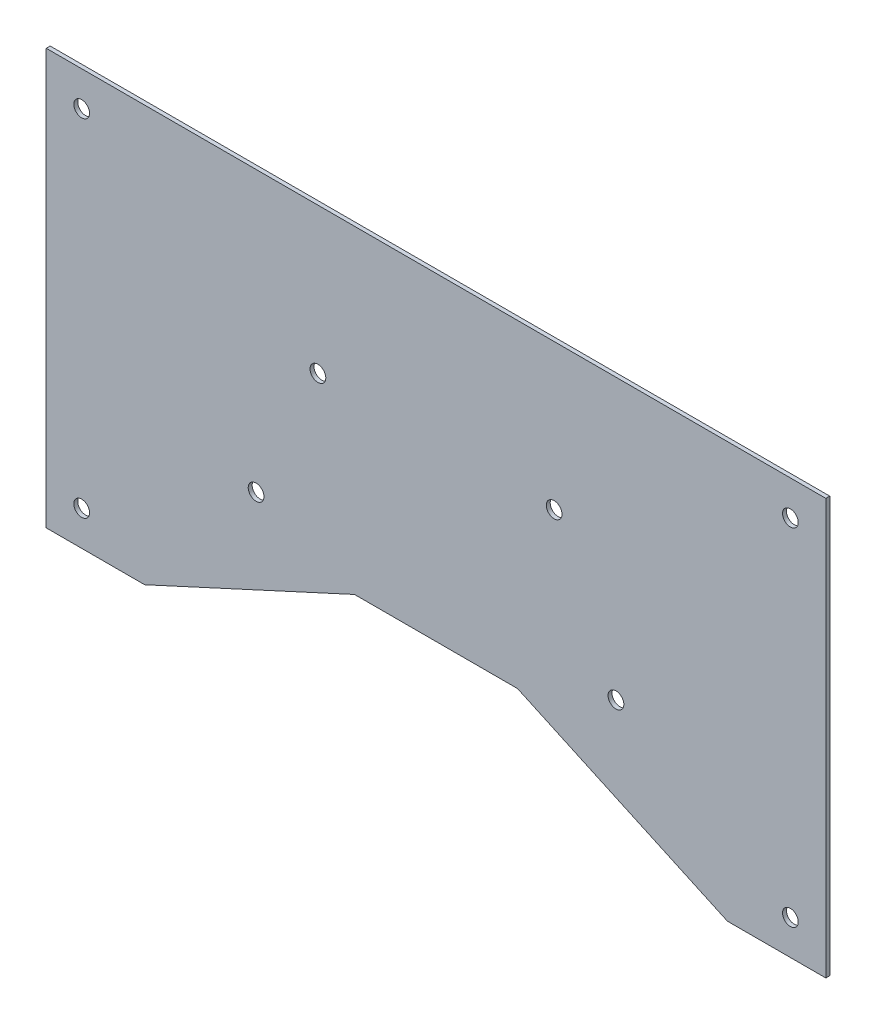
ISO-10303-21;
HEADER;
FILE_DESCRIPTION(('STEP AP214'),'2;1');
FILE_NAME('part.step','',(''),(''),'','','');
FILE_SCHEMA(('AUTOMOTIVE_DESIGN { 1 0 10303 214 1 1 1 1 }'));
ENDSEC;
DATA;
#1=APPLICATION_CONTEXT('core data for automotive mechanical design processes');
#2=APPLICATION_PROTOCOL_DEFINITION('international standard','automotive_design',2000,#1);
#3=PRODUCT_CONTEXT('',#1,'mechanical');
#4=PRODUCT('Part','Part','',(#3));
#5=PRODUCT_RELATED_PRODUCT_CATEGORY('part','',(#4));
#6=PRODUCT_DEFINITION_FORMATION('','',#4);
#7=PRODUCT_DEFINITION_CONTEXT('part definition',#1,'design');
#8=PRODUCT_DEFINITION('design','',#6,#7);
#9=PRODUCT_DEFINITION_SHAPE('','',#8);
#10=(LENGTH_UNIT() NAMED_UNIT(*) SI_UNIT(.MILLI.,.METRE.));
#11=(NAMED_UNIT(*) PLANE_ANGLE_UNIT() SI_UNIT($,.RADIAN.));
#12=(NAMED_UNIT(*) SI_UNIT($,.STERADIAN.) SOLID_ANGLE_UNIT());
#13=UNCERTAINTY_MEASURE_WITH_UNIT(LENGTH_MEASURE(1.E-05),#10,'distance_accuracy_value','');
#14=(GEOMETRIC_REPRESENTATION_CONTEXT(3) GLOBAL_UNCERTAINTY_ASSIGNED_CONTEXT((#13)) GLOBAL_UNIT_ASSIGNED_CONTEXT((#10,
#11,#12)) REPRESENTATION_CONTEXT('',''));
#15=CARTESIAN_POINT('',(0.,0.,0.));
#16=DIRECTION('',(0.,0.,1.));
#17=DIRECTION('',(1.,0.,0.));
#18=AXIS2_PLACEMENT_3D('',#15,#16,#17);
#19=CARTESIAN_POINT('',(0.,0.,0.));
#20=DIRECTION('',(0.,-1.,0.));
#21=DIRECTION('',(-1.,0.,0.));
#22=AXIS2_PLACEMENT_3D('',#19,#20,#21);
#23=PLANE('',#22);
#24=DIRECTION('',(0.,0.,-1.));
#25=VECTOR('',#24,1.);
#26=CARTESIAN_POINT('',(-74.,0.,0.));
#27=LINE('',#26,#25);
#28=CARTESIAN_POINT('',(-74.,0.,0.));
#29=VERTEX_POINT('',#28);
#30=CARTESIAN_POINT('',(-74.,0.,-1.));
#31=VERTEX_POINT('',#30);
#32=EDGE_CURVE('E158',#29,#31,#27,.T.);
#33=ORIENTED_EDGE('',*,*,#32,.F.);
#34=DIRECTION('',(1.,0.,0.));
#35=VECTOR('',#34,1.);
#36=CARTESIAN_POINT('',(-99.,0.,0.));
#37=LINE('',#36,#35);
#38=CARTESIAN_POINT('',(-99.,0.,0.));
#39=VERTEX_POINT('',#38);
#40=EDGE_CURVE('E138',#39,#29,#37,.T.);
#41=ORIENTED_EDGE('',*,*,#40,.F.);
#42=DIRECTION('',(0.,0.,1.));
#43=VECTOR('',#42,1.);
#44=CARTESIAN_POINT('',(-99.,0.,-1.));
#45=LINE('',#44,#43);
#46=CARTESIAN_POINT('',(-99.,0.,-1.));
#47=VERTEX_POINT('',#46);
#48=EDGE_CURVE('E141',#47,#39,#45,.T.);
#49=ORIENTED_EDGE('',*,*,#48,.F.);
#50=DIRECTION('',(1.,0.,0.));
#51=VECTOR('',#50,1.);
#52=CARTESIAN_POINT('',(-99.,0.,-1.));
#53=LINE('',#52,#51);
#54=EDGE_CURVE('E123',#47,#31,#53,.T.);
#55=ORIENTED_EDGE('',*,*,#54,.T.);
#56=EDGE_LOOP('',(#33,#41,#49,#55));
#57=FACE_BOUND('',#56,.T.);
#58=ADVANCED_FACE('F36',(#57),#23,.T.);
#59=CARTESIAN_POINT('',(-99.,203.5,-1.));
#60=DIRECTION('',(0.,0.,1.));
#61=DIRECTION('',(-1.,0.,0.));
#62=AXIS2_PLACEMENT_3D('',#59,#60,#61);
#63=PLANE('',#62);
#64=CARTESIAN_POINT('',(90.,96.69,-1.));
#65=DIRECTION('',(0.,0.,1.));
#66=DIRECTION('',(1.,0.,0.));
#67=AXIS2_PLACEMENT_3D('',#64,#65,#66);
#68=CIRCLE('',#67,2.);
#69=CARTESIAN_POINT('',(92.,96.69,-1.));
#70=VERTEX_POINT('',#69);
#71=EDGE_CURVE('E423',#70,#70,#68,.T.);
#72=ORIENTED_EDGE('',*,*,#71,.T.);
#73=EDGE_LOOP('',(#72));
#74=FACE_BOUND('',#73,.T.);
#75=CARTESIAN_POINT('',(-90.,96.69,-1.));
#76=DIRECTION('',(0.,0.,1.));
#77=DIRECTION('',(1.,0.,0.));
#78=AXIS2_PLACEMENT_3D('',#75,#76,#77);
#79=CIRCLE('',#78,2.);
#80=CARTESIAN_POINT('',(-88.,96.69,-1.));
#81=VERTEX_POINT('',#80);
#82=EDGE_CURVE('E410',#81,#81,#79,.T.);
#83=ORIENTED_EDGE('',*,*,#82,.T.);
#84=EDGE_LOOP('',(#83));
#85=FACE_BOUND('',#84,.T.);
#86=CARTESIAN_POINT('',(-30.,68.5,-1.));
#87=DIRECTION('',(0.,0.,1.));
#88=DIRECTION('',(1.,0.,0.));
#89=AXIS2_PLACEMENT_3D('',#86,#87,#88);
#90=CIRCLE('',#89,2.);
#91=CARTESIAN_POINT('',(-28.,68.5,-1.));
#92=VERTEX_POINT('',#91);
#93=EDGE_CURVE('E132',#92,#92,#90,.T.);
#94=ORIENTED_EDGE('',*,*,#93,.T.);
#95=EDGE_LOOP('',(#94));
#96=FACE_BOUND('',#95,.T.);
#97=CARTESIAN_POINT('',(-90.,8.81999999999999,-1.));
#98=DIRECTION('',(0.,0.,1.));
#99=DIRECTION('',(1.,0.,0.));
#100=AXIS2_PLACEMENT_3D('',#97,#98,#99);
#101=CIRCLE('',#100,2.);
#102=CARTESIAN_POINT('',(-88.,8.81999999999999,-1.));
#103=VERTEX_POINT('',#102);
#104=EDGE_CURVE('E195',#103,#103,#101,.T.);
#105=ORIENTED_EDGE('',*,*,#104,.T.);
#106=EDGE_LOOP('',(#105));
#107=FACE_BOUND('',#106,.T.);
#108=CARTESIAN_POINT('',(90.,8.81999999999999,-1.));
#109=DIRECTION('',(0.,0.,1.));
#110=DIRECTION('',(1.,0.,0.));
#111=AXIS2_PLACEMENT_3D('',#108,#109,#110);
#112=CIRCLE('',#111,2.);
#113=CARTESIAN_POINT('',(92.,8.81999999999999,-1.));
#114=VERTEX_POINT('',#113);
#115=EDGE_CURVE('E135',#114,#114,#112,.T.);
#116=ORIENTED_EDGE('',*,*,#115,.T.);
#117=EDGE_LOOP('',(#116));
#118=FACE_BOUND('',#117,.T.);
#119=CARTESIAN_POINT('',(-45.7,34.51,-1.));
#120=DIRECTION('',(0.,0.,1.));
#121=DIRECTION('',(1.,0.,0.));
#122=AXIS2_PLACEMENT_3D('',#119,#120,#121);
#123=CIRCLE('',#122,2.);
#124=CARTESIAN_POINT('',(-43.7,34.51,-1.));
#125=VERTEX_POINT('',#124);
#126=EDGE_CURVE('E179',#125,#125,#123,.T.);
#127=ORIENTED_EDGE('',*,*,#126,.T.);
#128=EDGE_LOOP('',(#127));
#129=FACE_BOUND('',#128,.T.);
#130=CARTESIAN_POINT('',(45.7,34.51,-1.));
#131=DIRECTION('',(0.,0.,1.));
#132=DIRECTION('',(1.,0.,0.));
#133=AXIS2_PLACEMENT_3D('',#130,#131,#132);
#134=CIRCLE('',#133,2.);
#135=CARTESIAN_POINT('',(47.7,34.51,-1.));
#136=VERTEX_POINT('',#135);
#137=EDGE_CURVE('E185',#136,#136,#134,.T.);
#138=ORIENTED_EDGE('',*,*,#137,.T.);
#139=EDGE_LOOP('',(#138));
#140=FACE_BOUND('',#139,.T.);
#141=CARTESIAN_POINT('',(30.,68.5,-1.));
#142=DIRECTION('',(0.,0.,1.));
#143=DIRECTION('',(-1.,0.,0.));
#144=AXIS2_PLACEMENT_3D('',#141,#142,#143);
#145=CIRCLE('',#144,2.);
#146=CARTESIAN_POINT('',(28.,68.5,-1.));
#147=VERTEX_POINT('',#146);
#148=EDGE_CURVE('E161',#147,#147,#145,.T.);
#149=ORIENTED_EDGE('',*,*,#148,.T.);
#150=EDGE_LOOP('',(#149));
#151=FACE_BOUND('',#150,.T.);
#152=DIRECTION('',(0.,-1.,0.));
#153=VECTOR('',#152,1.);
#154=CARTESIAN_POINT('',(-99.,203.5,-1.));
#155=LINE('',#154,#153);
#156=CARTESIAN_POINT('',(-99.,105.5,-1.));
#157=VERTEX_POINT('',#156);
#158=EDGE_CURVE('E114',#157,#47,#155,.T.);
#159=ORIENTED_EDGE('',*,*,#158,.F.);
#160=DIRECTION('',(1.,0.,0.));
#161=VECTOR('',#160,1.);
#162=CARTESIAN_POINT('',(-99.,105.5,-1.));
#163=LINE('',#162,#161);
#164=CARTESIAN_POINT('',(99.,105.5,-1.));
#165=VERTEX_POINT('',#164);
#166=EDGE_CURVE('E51',#157,#165,#163,.T.);
#167=ORIENTED_EDGE('',*,*,#166,.T.);
#168=DIRECTION('',(0.,-1.,0.));
#169=VECTOR('',#168,1.);
#170=CARTESIAN_POINT('',(99.,203.5,-1.));
#171=LINE('',#170,#169);
#172=CARTESIAN_POINT('',(99.,0.,-1.));
#173=VERTEX_POINT('',#172);
#174=EDGE_CURVE('E11',#165,#173,#171,.T.);
#175=ORIENTED_EDGE('',*,*,#174,.T.);
#176=CARTESIAN_POINT('',(74.,0.,-1.));
#177=VERTEX_POINT('',#176);
#178=EDGE_CURVE('E125',#177,#173,#53,.T.);
#179=ORIENTED_EDGE('',*,*,#178,.F.);
#180=DIRECTION('',(-0.908542219079559,0.417793054214633,0.));
#181=VECTOR('',#180,1.);
#182=CARTESIAN_POINT('',(20.7,24.51,-1.));
#183=LINE('',#182,#181);
#184=CARTESIAN_POINT('',(20.7,24.51,-1.));
#185=VERTEX_POINT('',#184);
#186=EDGE_CURVE('E406',#177,#185,#183,.T.);
#187=ORIENTED_EDGE('',*,*,#186,.T.);
#188=DIRECTION('',(-1.,0.,0.));
#189=VECTOR('',#188,1.);
#190=CARTESIAN_POINT('',(-20.7,24.51,-1.));
#191=LINE('',#190,#189);
#192=CARTESIAN_POINT('',(-20.7,24.51,-1.));
#193=VERTEX_POINT('',#192);
#194=EDGE_CURVE('E409',#185,#193,#191,.T.);
#195=ORIENTED_EDGE('',*,*,#194,.T.);
#196=DIRECTION('',(-0.908542219079559,-0.417793054214633,0.));
#197=VECTOR('',#196,1.);
#198=CARTESIAN_POINT('',(-74.,0.,-1.));
#199=LINE('',#198,#197);
#200=EDGE_CURVE('E170',#193,#31,#199,.T.);
#201=ORIENTED_EDGE('',*,*,#200,.T.);
#202=ORIENTED_EDGE('',*,*,#54,.F.);
#203=EDGE_LOOP('',(#159,#167,#175,#179,#187,#195,#201,#202));
#204=FACE_BOUND('',#203,.T.);
#205=ADVANCED_FACE('F38',(#74,#85,#96,#107,#118,#129,#140,#151,#204),#63,.F.);
#206=CARTESIAN_POINT('',(99.,203.5,0.));
#207=DIRECTION('',(1.,0.,0.));
#208=DIRECTION('',(0.,0.,1.));
#209=AXIS2_PLACEMENT_3D('',#206,#207,#208);
#210=PLANE('',#209);
#211=DIRECTION('',(0.,0.,1.));
#212=VECTOR('',#211,1.);
#213=CARTESIAN_POINT('',(99.,105.5,-1.));
#214=LINE('',#213,#212);
#215=CARTESIAN_POINT('',(99.,105.5,0.));
#216=VERTEX_POINT('',#215);
#217=EDGE_CURVE('E99',#165,#216,#214,.T.);
#218=ORIENTED_EDGE('',*,*,#217,.T.);
#219=DIRECTION('',(0.,-1.,0.));
#220=VECTOR('',#219,1.);
#221=CARTESIAN_POINT('',(99.,203.5,0.));
#222=LINE('',#221,#220);
#223=CARTESIAN_POINT('',(99.,0.,0.));
#224=VERTEX_POINT('',#223);
#225=EDGE_CURVE('E44',#216,#224,#222,.T.);
#226=ORIENTED_EDGE('',*,*,#225,.T.);
#227=DIRECTION('',(0.,0.,-1.));
#228=VECTOR('',#227,1.);
#229=CARTESIAN_POINT('',(99.,0.,0.));
#230=LINE('',#229,#228);
#231=EDGE_CURVE('E118',#224,#173,#230,.T.);
#232=ORIENTED_EDGE('',*,*,#231,.T.);
#233=ORIENTED_EDGE('',*,*,#174,.F.);
#234=EDGE_LOOP('',(#218,#226,#232,#233));
#235=FACE_BOUND('',#234,.T.);
#236=ADVANCED_FACE('F116',(#235),#210,.T.);
#237=CARTESIAN_POINT('',(-99.,203.5,0.));
#238=DIRECTION('',(0.,0.,1.));
#239=DIRECTION('',(-1.,0.,0.));
#240=AXIS2_PLACEMENT_3D('',#237,#238,#239);
#241=PLANE('',#240);
#242=DIRECTION('',(1.,0.,0.));
#243=VECTOR('',#242,1.);
#244=CARTESIAN_POINT('',(-99.,105.5,0.));
#245=LINE('',#244,#243);
#246=CARTESIAN_POINT('',(-99.,105.5,0.));
#247=VERTEX_POINT('',#246);
#248=EDGE_CURVE('E102',#247,#216,#245,.T.);
#249=ORIENTED_EDGE('',*,*,#248,.F.);
#250=DIRECTION('',(0.,-1.,0.));
#251=VECTOR('',#250,1.);
#252=CARTESIAN_POINT('',(-99.,203.5,0.));
#253=LINE('',#252,#251);
#254=EDGE_CURVE('E145',#247,#39,#253,.T.);
#255=ORIENTED_EDGE('',*,*,#254,.T.);
#256=ORIENTED_EDGE('',*,*,#40,.T.);
#257=DIRECTION('',(-0.908542219079559,-0.417793054214633,0.));
#258=VECTOR('',#257,1.);
#259=CARTESIAN_POINT('',(-74.,0.,0.));
#260=LINE('',#259,#258);
#261=CARTESIAN_POINT('',(-20.7,24.51,0.));
#262=VERTEX_POINT('',#261);
#263=EDGE_CURVE('E175',#262,#29,#260,.T.);
#264=ORIENTED_EDGE('',*,*,#263,.F.);
#265=DIRECTION('',(-1.,0.,0.));
#266=VECTOR('',#265,1.);
#267=CARTESIAN_POINT('',(-20.7,24.51,0.));
#268=LINE('',#267,#266);
#269=CARTESIAN_POINT('',(20.7,24.51,0.));
#270=VERTEX_POINT('',#269);
#271=EDGE_CURVE('E417',#270,#262,#268,.T.);
#272=ORIENTED_EDGE('',*,*,#271,.F.);
#273=DIRECTION('',(-0.908542219079559,0.417793054214633,0.));
#274=VECTOR('',#273,1.);
#275=CARTESIAN_POINT('',(20.7,24.51,0.));
#276=LINE('',#275,#274);
#277=CARTESIAN_POINT('',(74.,0.,0.));
#278=VERTEX_POINT('',#277);
#279=EDGE_CURVE('E420',#278,#270,#276,.T.);
#280=ORIENTED_EDGE('',*,*,#279,.F.);
#281=EDGE_CURVE('E122',#278,#224,#37,.T.);
#282=ORIENTED_EDGE('',*,*,#281,.T.);
#283=ORIENTED_EDGE('',*,*,#225,.F.);
#284=EDGE_LOOP('',(#249,#255,#256,#264,#272,#280,#282,#283));
#285=FACE_BOUND('',#284,.T.);
#286=CARTESIAN_POINT('',(90.,96.69,0.));
#287=DIRECTION('',(0.,0.,1.));
#288=DIRECTION('',(1.,0.,0.));
#289=AXIS2_PLACEMENT_3D('',#286,#287,#288);
#290=CIRCLE('',#289,2.);
#291=CARTESIAN_POINT('',(92.,96.69,0.));
#292=VERTEX_POINT('',#291);
#293=EDGE_CURVE('E106',#292,#292,#290,.T.);
#294=ORIENTED_EDGE('',*,*,#293,.F.);
#295=EDGE_LOOP('',(#294));
#296=FACE_BOUND('',#295,.T.);
#297=CARTESIAN_POINT('',(-90.,96.69,0.));
#298=DIRECTION('',(0.,0.,1.));
#299=DIRECTION('',(1.,0.,0.));
#300=AXIS2_PLACEMENT_3D('',#297,#298,#299);
#301=CIRCLE('',#300,2.);
#302=CARTESIAN_POINT('',(-88.,96.69,0.));
#303=VERTEX_POINT('',#302);
#304=EDGE_CURVE('E413',#303,#303,#301,.T.);
#305=ORIENTED_EDGE('',*,*,#304,.F.);
#306=EDGE_LOOP('',(#305));
#307=FACE_BOUND('',#306,.T.);
#308=CARTESIAN_POINT('',(-30.,68.5,0.));
#309=DIRECTION('',(0.,0.,1.));
#310=DIRECTION('',(1.,0.,0.));
#311=AXIS2_PLACEMENT_3D('',#308,#309,#310);
#312=CIRCLE('',#311,2.);
#313=CARTESIAN_POINT('',(-28.,68.5,0.));
#314=VERTEX_POINT('',#313);
#315=EDGE_CURVE('E128',#314,#314,#312,.T.);
#316=ORIENTED_EDGE('',*,*,#315,.F.);
#317=EDGE_LOOP('',(#316));
#318=FACE_BOUND('',#317,.T.);
#319=CARTESIAN_POINT('',(-90.,8.81999999999999,0.));
#320=DIRECTION('',(0.,0.,1.));
#321=DIRECTION('',(1.,0.,0.));
#322=AXIS2_PLACEMENT_3D('',#319,#320,#321);
#323=CIRCLE('',#322,2.);
#324=CARTESIAN_POINT('',(-88.,8.81999999999999,0.));
#325=VERTEX_POINT('',#324);
#326=EDGE_CURVE('E192',#325,#325,#323,.T.);
#327=ORIENTED_EDGE('',*,*,#326,.F.);
#328=EDGE_LOOP('',(#327));
#329=FACE_BOUND('',#328,.T.);
#330=CARTESIAN_POINT('',(90.,8.81999999999999,0.));
#331=DIRECTION('',(0.,0.,1.));
#332=DIRECTION('',(1.,0.,0.));
#333=AXIS2_PLACEMENT_3D('',#330,#331,#332);
#334=CIRCLE('',#333,2.);
#335=CARTESIAN_POINT('',(92.,8.81999999999999,0.));
#336=VERTEX_POINT('',#335);
#337=EDGE_CURVE('E197',#336,#336,#334,.T.);
#338=ORIENTED_EDGE('',*,*,#337,.F.);
#339=EDGE_LOOP('',(#338));
#340=FACE_BOUND('',#339,.T.);
#341=CARTESIAN_POINT('',(-45.7,34.51,0.));
#342=DIRECTION('',(0.,0.,1.));
#343=DIRECTION('',(1.,0.,0.));
#344=AXIS2_PLACEMENT_3D('',#341,#342,#343);
#345=CIRCLE('',#344,2.);
#346=CARTESIAN_POINT('',(-43.7,34.51,0.));
#347=VERTEX_POINT('',#346);
#348=EDGE_CURVE('E176',#347,#347,#345,.T.);
#349=ORIENTED_EDGE('',*,*,#348,.F.);
#350=EDGE_LOOP('',(#349));
#351=FACE_BOUND('',#350,.T.);
#352=CARTESIAN_POINT('',(45.7,34.51,0.));
#353=DIRECTION('',(0.,0.,1.));
#354=DIRECTION('',(1.,0.,0.));
#355=AXIS2_PLACEMENT_3D('',#352,#353,#354);
#356=CIRCLE('',#355,2.);
#357=CARTESIAN_POINT('',(47.7,34.51,0.));
#358=VERTEX_POINT('',#357);
#359=EDGE_CURVE('E182',#358,#358,#356,.T.);
#360=ORIENTED_EDGE('',*,*,#359,.F.);
#361=EDGE_LOOP('',(#360));
#362=FACE_BOUND('',#361,.T.);
#363=CARTESIAN_POINT('',(30.,68.5,0.));
#364=DIRECTION('',(0.,0.,1.));
#365=DIRECTION('',(-1.,0.,0.));
#366=AXIS2_PLACEMENT_3D('',#363,#364,#365);
#367=CIRCLE('',#366,2.);
#368=CARTESIAN_POINT('',(28.,68.5,0.));
#369=VERTEX_POINT('',#368);
#370=EDGE_CURVE('E165',#369,#369,#367,.T.);
#371=ORIENTED_EDGE('',*,*,#370,.F.);
#372=EDGE_LOOP('',(#371));
#373=FACE_BOUND('',#372,.T.);
#374=ADVANCED_FACE('F148',(#285,#296,#307,#318,#329,#340,#351,#362,#373),#241,.T.);
#375=CARTESIAN_POINT('',(-99.,203.5,-1.));
#376=DIRECTION('',(-1.,0.,0.));
#377=DIRECTION('',(0.,0.,-1.));
#378=AXIS2_PLACEMENT_3D('',#375,#376,#377);
#379=PLANE('',#378);
#380=DIRECTION('',(0.,0.,1.));
#381=VECTOR('',#380,1.);
#382=CARTESIAN_POINT('',(-99.,105.5,-1.));
#383=LINE('',#382,#381);
#384=EDGE_CURVE('E107',#157,#247,#383,.T.);
#385=ORIENTED_EDGE('',*,*,#384,.F.);
#386=ORIENTED_EDGE('',*,*,#158,.T.);
#387=ORIENTED_EDGE('',*,*,#48,.T.);
#388=ORIENTED_EDGE('',*,*,#254,.F.);
#389=EDGE_LOOP('',(#385,#386,#387,#388));
#390=FACE_BOUND('',#389,.T.);
#391=ADVANCED_FACE('F155',(#390),#379,.T.);
#392=DIRECTION('',(0.,0.,-1.));
#393=VECTOR('',#392,1.);
#394=CARTESIAN_POINT('',(74.,0.,0.));
#395=LINE('',#394,#393);
#396=EDGE_CURVE('E59',#278,#177,#395,.T.);
#397=ORIENTED_EDGE('',*,*,#396,.T.);
#398=ORIENTED_EDGE('',*,*,#178,.T.);
#399=ORIENTED_EDGE('',*,*,#231,.F.);
#400=ORIENTED_EDGE('',*,*,#281,.F.);
#401=EDGE_LOOP('',(#397,#398,#399,#400));
#402=FACE_BOUND('',#401,.T.);
#403=ADVANCED_FACE('F126',(#402),#23,.T.);
#404=CARTESIAN_POINT('',(30.,68.5,0.));
#405=DIRECTION('',(0.,0.,-1.));
#406=DIRECTION('',(1.,0.,0.));
#407=AXIS2_PLACEMENT_3D('',#404,#405,#406);
#408=CYLINDRICAL_SURFACE('',#407,2.);
#409=ORIENTED_EDGE('',*,*,#370,.T.);
#410=EDGE_LOOP('',(#409));
#411=FACE_BOUND('',#410,.T.);
#412=ORIENTED_EDGE('',*,*,#148,.F.);
#413=EDGE_LOOP('',(#412));
#414=FACE_BOUND('',#413,.T.);
#415=ADVANCED_FACE('F229',(#411,#414),#408,.F.);
#416=CARTESIAN_POINT('',(45.7,34.51,0.));
#417=DIRECTION('',(0.,0.,-1.));
#418=DIRECTION('',(1.,0.,0.));
#419=AXIS2_PLACEMENT_3D('',#416,#417,#418);
#420=CYLINDRICAL_SURFACE('',#419,2.);
#421=ORIENTED_EDGE('',*,*,#359,.T.);
#422=EDGE_LOOP('',(#421));
#423=FACE_BOUND('',#422,.T.);
#424=ORIENTED_EDGE('',*,*,#137,.F.);
#425=EDGE_LOOP('',(#424));
#426=FACE_BOUND('',#425,.T.);
#427=ADVANCED_FACE('F218',(#423,#426),#420,.F.);
#428=CARTESIAN_POINT('',(-45.7,34.51,0.));
#429=DIRECTION('',(0.,0.,-1.));
#430=DIRECTION('',(1.,0.,0.));
#431=AXIS2_PLACEMENT_3D('',#428,#429,#430);
#432=CYLINDRICAL_SURFACE('',#431,2.);
#433=ORIENTED_EDGE('',*,*,#348,.T.);
#434=EDGE_LOOP('',(#433));
#435=FACE_BOUND('',#434,.T.);
#436=ORIENTED_EDGE('',*,*,#126,.F.);
#437=EDGE_LOOP('',(#436));
#438=FACE_BOUND('',#437,.T.);
#439=ADVANCED_FACE('F209',(#435,#438),#432,.F.);
#440=CARTESIAN_POINT('',(90.,8.81999999999999,0.));
#441=DIRECTION('',(0.,0.,-1.));
#442=DIRECTION('',(1.,0.,0.));
#443=AXIS2_PLACEMENT_3D('',#440,#441,#442);
#444=CYLINDRICAL_SURFACE('',#443,2.);
#445=ORIENTED_EDGE('',*,*,#337,.T.);
#446=EDGE_LOOP('',(#445));
#447=FACE_BOUND('',#446,.T.);
#448=ORIENTED_EDGE('',*,*,#115,.F.);
#449=EDGE_LOOP('',(#448));
#450=FACE_BOUND('',#449,.T.);
#451=ADVANCED_FACE('F206',(#447,#450),#444,.F.);
#452=CARTESIAN_POINT('',(-90.,8.81999999999999,0.));
#453=DIRECTION('',(0.,0.,-1.));
#454=DIRECTION('',(1.,0.,0.));
#455=AXIS2_PLACEMENT_3D('',#452,#453,#454);
#456=CYLINDRICAL_SURFACE('',#455,2.);
#457=ORIENTED_EDGE('',*,*,#326,.T.);
#458=EDGE_LOOP('',(#457));
#459=FACE_BOUND('',#458,.T.);
#460=ORIENTED_EDGE('',*,*,#104,.F.);
#461=EDGE_LOOP('',(#460));
#462=FACE_BOUND('',#461,.T.);
#463=ADVANCED_FACE('F208',(#459,#462),#456,.F.);
#464=CARTESIAN_POINT('',(-30.,68.5,0.));
#465=DIRECTION('',(0.,0.,-1.));
#466=DIRECTION('',(1.,0.,0.));
#467=AXIS2_PLACEMENT_3D('',#464,#465,#466);
#468=CYLINDRICAL_SURFACE('',#467,2.);
#469=ORIENTED_EDGE('',*,*,#315,.T.);
#470=EDGE_LOOP('',(#469));
#471=FACE_BOUND('',#470,.T.);
#472=ORIENTED_EDGE('',*,*,#93,.F.);
#473=EDGE_LOOP('',(#472));
#474=FACE_BOUND('',#473,.T.);
#475=ADVANCED_FACE('F215',(#471,#474),#468,.F.);
#476=CARTESIAN_POINT('',(-74.,0.,0.));
#477=DIRECTION('',(-0.417793054214633,0.908542219079559,0.));
#478=DIRECTION('',(-0.908542219079559,-0.417793054214633,0.));
#479=AXIS2_PLACEMENT_3D('',#476,#477,#478);
#480=PLANE('',#479);
#481=ORIENTED_EDGE('',*,*,#200,.F.);
#482=DIRECTION('',(0.,0.,-1.));
#483=VECTOR('',#482,1.);
#484=CARTESIAN_POINT('',(-20.7,24.51,0.));
#485=LINE('',#484,#483);
#486=EDGE_CURVE('E162',#262,#193,#485,.T.);
#487=ORIENTED_EDGE('',*,*,#486,.F.);
#488=ORIENTED_EDGE('',*,*,#263,.T.);
#489=ORIENTED_EDGE('',*,*,#32,.T.);
#490=EDGE_LOOP('',(#481,#487,#488,#489));
#491=FACE_BOUND('',#490,.T.);
#492=ADVANCED_FACE('F294',(#491),#480,.F.);
#493=CARTESIAN_POINT('',(-20.7,24.51,0.));
#494=DIRECTION('',(0.,1.,0.));
#495=DIRECTION('',(0.,0.,-1.));
#496=AXIS2_PLACEMENT_3D('',#493,#494,#495);
#497=PLANE('',#496);
#498=ORIENTED_EDGE('',*,*,#194,.F.);
#499=DIRECTION('',(0.,0.,-1.));
#500=VECTOR('',#499,1.);
#501=CARTESIAN_POINT('',(20.7,24.51,0.));
#502=LINE('',#501,#500);
#503=EDGE_CURVE('E167',#270,#185,#502,.T.);
#504=ORIENTED_EDGE('',*,*,#503,.F.);
#505=ORIENTED_EDGE('',*,*,#271,.T.);
#506=ORIENTED_EDGE('',*,*,#486,.T.);
#507=EDGE_LOOP('',(#498,#504,#505,#506));
#508=FACE_BOUND('',#507,.T.);
#509=ADVANCED_FACE('F297',(#508),#497,.F.);
#510=CARTESIAN_POINT('',(20.7,24.51,0.));
#511=DIRECTION('',(0.417793054214633,0.908542219079559,0.));
#512=DIRECTION('',(-0.908542219079559,0.417793054214633,0.));
#513=AXIS2_PLACEMENT_3D('',#510,#511,#512);
#514=PLANE('',#513);
#515=ORIENTED_EDGE('',*,*,#186,.F.);
#516=ORIENTED_EDGE('',*,*,#396,.F.);
#517=ORIENTED_EDGE('',*,*,#279,.T.);
#518=ORIENTED_EDGE('',*,*,#503,.T.);
#519=EDGE_LOOP('',(#515,#516,#517,#518));
#520=FACE_BOUND('',#519,.T.);
#521=ADVANCED_FACE('F266',(#520),#514,.F.);
#522=CARTESIAN_POINT('',(-99.,105.5,-1.));
#523=DIRECTION('',(0.,-1.,0.));
#524=DIRECTION('',(0.,0.,-1.));
#525=AXIS2_PLACEMENT_3D('',#522,#523,#524);
#526=PLANE('',#525);
#527=ORIENTED_EDGE('',*,*,#248,.T.);
#528=ORIENTED_EDGE('',*,*,#217,.F.);
#529=ORIENTED_EDGE('',*,*,#166,.F.);
#530=ORIENTED_EDGE('',*,*,#384,.T.);
#531=EDGE_LOOP('',(#527,#528,#529,#530));
#532=FACE_BOUND('',#531,.T.);
#533=ADVANCED_FACE('F100',(#532),#526,.F.);
#534=CARTESIAN_POINT('',(-90.,96.69,-1.));
#535=DIRECTION('',(0.,0.,1.));
#536=DIRECTION('',(1.,0.,0.));
#537=AXIS2_PLACEMENT_3D('',#534,#535,#536);
#538=CYLINDRICAL_SURFACE('',#537,2.);
#539=ORIENTED_EDGE('',*,*,#82,.F.);
#540=EDGE_LOOP('',(#539));
#541=FACE_BOUND('',#540,.T.);
#542=ORIENTED_EDGE('',*,*,#304,.T.);
#543=EDGE_LOOP('',(#542));
#544=FACE_BOUND('',#543,.T.);
#545=ADVANCED_FACE('F265',(#541,#544),#538,.F.);
#546=CARTESIAN_POINT('',(90.,96.69,-1.));
#547=DIRECTION('',(0.,0.,1.));
#548=DIRECTION('',(1.,0.,0.));
#549=AXIS2_PLACEMENT_3D('',#546,#547,#548);
#550=CYLINDRICAL_SURFACE('',#549,2.);
#551=ORIENTED_EDGE('',*,*,#71,.F.);
#552=EDGE_LOOP('',(#551));
#553=FACE_BOUND('',#552,.T.);
#554=ORIENTED_EDGE('',*,*,#293,.T.);
#555=EDGE_LOOP('',(#554));
#556=FACE_BOUND('',#555,.T.);
#557=ADVANCED_FACE('F277',(#553,#556),#550,.F.);
#558=CLOSED_SHELL('',(#58,#205,#236,#374,#391,#403,#415,#427,#439,#451,#463,#475,#492,#509,#521,
#533,#545,#557));
#559=MANIFOLD_SOLID_BREP('B2',#558);
#560=ADVANCED_BREP_SHAPE_REPRESENTATION('',(#18,#559),#14);
#561=SHAPE_DEFINITION_REPRESENTATION(#9,#560);
ENDSEC;
END-ISO-10303-21;
